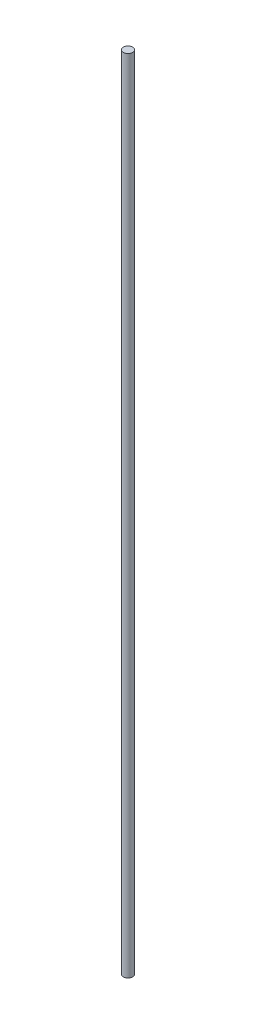
ISO-10303-21;
HEADER;
FILE_DESCRIPTION(('STEP AP214'),'2;1');
FILE_NAME('part.step','',(''),(''),'','','');
FILE_SCHEMA(('AUTOMOTIVE_DESIGN { 1 0 10303 214 1 1 1 1 }'));
ENDSEC;
DATA;
#1=APPLICATION_CONTEXT('core data for automotive mechanical design processes');
#2=APPLICATION_PROTOCOL_DEFINITION('international standard','automotive_design',2000,#1);
#3=PRODUCT_CONTEXT('',#1,'mechanical');
#4=PRODUCT('Part','Part','',(#3));
#5=PRODUCT_RELATED_PRODUCT_CATEGORY('part','',(#4));
#6=PRODUCT_DEFINITION_FORMATION('','',#4);
#7=PRODUCT_DEFINITION_CONTEXT('part definition',#1,'design');
#8=PRODUCT_DEFINITION('design','',#6,#7);
#9=PRODUCT_DEFINITION_SHAPE('','',#8);
#10=(LENGTH_UNIT() NAMED_UNIT(*) SI_UNIT(.MILLI.,.METRE.));
#11=(NAMED_UNIT(*) PLANE_ANGLE_UNIT() SI_UNIT($,.RADIAN.));
#12=(NAMED_UNIT(*) SI_UNIT($,.STERADIAN.) SOLID_ANGLE_UNIT());
#13=UNCERTAINTY_MEASURE_WITH_UNIT(LENGTH_MEASURE(1.E-05),#10,'distance_accuracy_value','');
#14=(GEOMETRIC_REPRESENTATION_CONTEXT(3) GLOBAL_UNCERTAINTY_ASSIGNED_CONTEXT((#13)) GLOBAL_UNIT_ASSIGNED_CONTEXT((#10,
#11,#12)) REPRESENTATION_CONTEXT('',''));
#15=CARTESIAN_POINT('',(0.,0.,0.));
#16=DIRECTION('',(0.,0.,1.));
#17=DIRECTION('',(1.,0.,0.));
#18=AXIS2_PLACEMENT_3D('',#15,#16,#17);
#19=CARTESIAN_POINT('',(0.,346.,0.));
#20=DIRECTION('',(0.,-1.,0.));
#21=DIRECTION('',(0.,0.,-1.));
#22=AXIS2_PLACEMENT_3D('',#19,#20,#21);
#23=PLANE('',#22);
#24=CARTESIAN_POINT('',(0.,346.,0.));
#25=DIRECTION('',(0.,-1.,0.));
#26=DIRECTION('',(1.,0.,0.));
#27=AXIS2_PLACEMENT_3D('',#24,#25,#26);
#28=CIRCLE('',#27,2.);
#29=CARTESIAN_POINT('',(2.00000000000007,346.,0.));
#30=VERTEX_POINT('',#29);
#31=EDGE_CURVE('E11',#30,#30,#28,.T.);
#32=ORIENTED_EDGE('',*,*,#31,.F.);
#33=EDGE_LOOP('',(#32));
#34=FACE_BOUND('',#33,.T.);
#35=ADVANCED_FACE('F17',(#34),#23,.F.);
#36=CARTESIAN_POINT('',(0.,363.3,0.));
#37=DIRECTION('',(0.,-1.,0.));
#38=DIRECTION('',(-1.,0.,0.));
#39=AXIS2_PLACEMENT_3D('',#36,#37,#38);
#40=CYLINDRICAL_SURFACE('',#39,2.);
#41=CARTESIAN_POINT('',(0.,0.,0.));
#42=DIRECTION('',(0.,-1.,0.));
#43=DIRECTION('',(1.,0.,0.));
#44=AXIS2_PLACEMENT_3D('',#41,#42,#43);
#45=CIRCLE('',#44,2.);
#46=CARTESIAN_POINT('',(2.00000000000007,0.,0.));
#47=VERTEX_POINT('',#46);
#48=EDGE_CURVE('E42',#47,#47,#45,.T.);
#49=ORIENTED_EDGE('',*,*,#48,.F.);
#50=DIRECTION('',(0.,1.,0.));
#51=VECTOR('',#50,1.);
#52=CARTESIAN_POINT('',(2.00000000000007,363.3,0.));
#53=LINE('',#52,#51);
#54=EDGE_CURVE('E20',#47,#30,#53,.T.);
#55=ORIENTED_EDGE('',*,*,#54,.T.);
#56=ORIENTED_EDGE('',*,*,#31,.T.);
#57=ORIENTED_EDGE('',*,*,#54,.F.);
#58=EDGE_LOOP('',(#49,#55,#56,#57));
#59=FACE_BOUND('',#58,.T.);
#60=ADVANCED_FACE('F41',(#59),#40,.T.);
#61=CARTESIAN_POINT('',(0.,0.,0.));
#62=DIRECTION('',(0.,-1.,0.));
#63=DIRECTION('',(0.,0.,-1.));
#64=AXIS2_PLACEMENT_3D('',#61,#62,#63);
#65=PLANE('',#64);
#66=ORIENTED_EDGE('',*,*,#48,.T.);
#67=EDGE_LOOP('',(#66));
#68=FACE_BOUND('',#67,.T.);
#69=ADVANCED_FACE('F45',(#68),#65,.T.);
#70=CLOSED_SHELL('',(#35,#60,#69));
#71=MANIFOLD_SOLID_BREP('B1',#70);
#72=ADVANCED_BREP_SHAPE_REPRESENTATION('',(#18,#71),#14);
#73=SHAPE_DEFINITION_REPRESENTATION(#9,#72);
ENDSEC;
END-ISO-10303-21;
